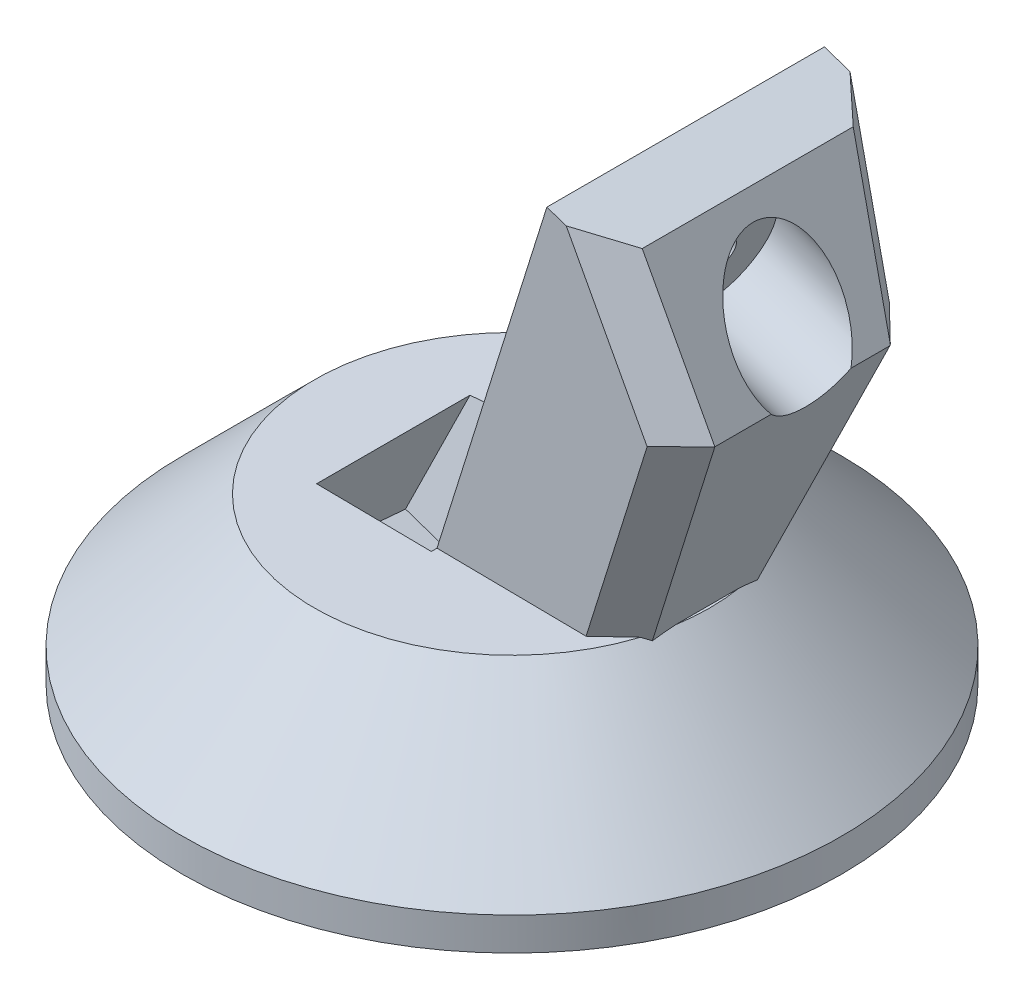
ISO-10303-21;
HEADER;
FILE_DESCRIPTION(('STEP AP214'),'2;1');
FILE_NAME('part.step','',(''),(''),'','','');
FILE_SCHEMA(('AUTOMOTIVE_DESIGN { 1 0 10303 214 1 1 1 1 }'));
ENDSEC;
DATA;
#1=APPLICATION_CONTEXT('core data for automotive mechanical design processes');
#2=APPLICATION_PROTOCOL_DEFINITION('international standard','automotive_design',2000,#1);
#3=PRODUCT_CONTEXT('',#1,'mechanical');
#4=PRODUCT('Part','Part','',(#3));
#5=PRODUCT_RELATED_PRODUCT_CATEGORY('part','',(#4));
#6=PRODUCT_DEFINITION_FORMATION('','',#4);
#7=PRODUCT_DEFINITION_CONTEXT('part definition',#1,'design');
#8=PRODUCT_DEFINITION('design','',#6,#7);
#9=PRODUCT_DEFINITION_SHAPE('','',#8);
#10=(LENGTH_UNIT() NAMED_UNIT(*) SI_UNIT(.MILLI.,.METRE.));
#11=(NAMED_UNIT(*) PLANE_ANGLE_UNIT() SI_UNIT($,.RADIAN.));
#12=(NAMED_UNIT(*) SI_UNIT($,.STERADIAN.) SOLID_ANGLE_UNIT());
#13=UNCERTAINTY_MEASURE_WITH_UNIT(LENGTH_MEASURE(1.E-05),#10,'distance_accuracy_value','');
#14=(GEOMETRIC_REPRESENTATION_CONTEXT(3) GLOBAL_UNCERTAINTY_ASSIGNED_CONTEXT((#13)) GLOBAL_UNIT_ASSIGNED_CONTEXT((#10,
#11,#12)) REPRESENTATION_CONTEXT('',''));
#15=CARTESIAN_POINT('',(0.,0.,0.));
#16=DIRECTION('',(0.,0.,1.));
#17=DIRECTION('',(1.,0.,0.));
#18=AXIS2_PLACEMENT_3D('',#15,#16,#17);
#19=CARTESIAN_POINT('',(-27.7596757204934,54.7423370391326,-3.17601245662759));
#20=DIRECTION('',(0.946930129495105,-0.321439465303162,0.));
#21=DIRECTION('',(0.321439465303162,0.946930129495106,0.));
#22=AXIS2_PLACEMENT_3D('',#19,#20,#21);
#23=CYLINDRICAL_SURFACE('',#22,1.5);
#24=CARTESIAN_POINT('',(10.0065690125101,41.922424423238,-3.17601245662759));
#25=DIRECTION('',(0.946930129495105,-0.321439465303162,0.));
#26=DIRECTION('',(-0.321439465303162,-0.946930129495106,0.));
#27=AXIS2_PLACEMENT_3D('',#24,#25,#26);
#28=CIRCLE('',#27,1.5);
#29=CARTESIAN_POINT('',(9.52440981455531,40.5020292289954,-3.17601245662759));
#30=VERTEX_POINT('',#29);
#31=EDGE_CURVE('E172',#30,#30,#28,.T.);
#32=ORIENTED_EDGE('',*,*,#31,.F.);
#33=EDGE_LOOP('',(#32));
#34=FACE_BOUND('',#33,.T.);
#35=CARTESIAN_POINT('',(15.6881497894807,39.993787631419,-3.17601245662759));
#36=DIRECTION('',(-0.946930129495106,0.321439465303162,0.));
#37=DIRECTION('',(0.321439465303162,0.946930129495105,0.));
#38=AXIS2_PLACEMENT_3D('',#35,#36,#37);
#39=CIRCLE('',#38,1.5);
#40=CARTESIAN_POINT('',(16.1703089874354,41.4141828256617,-3.17601245662759));
#41=VERTEX_POINT('',#40);
#42=EDGE_CURVE('E169',#41,#41,#39,.F.);
#43=ORIENTED_EDGE('',*,*,#42,.T.);
#44=EDGE_LOOP('',(#43));
#45=FACE_BOUND('',#44,.T.);
#46=ADVANCED_FACE('F37',(#34,#45),#23,.F.);
#47=CARTESIAN_POINT('',(-18.,15.,0.));
#48=DIRECTION('',(0.,1.,0.));
#49=DIRECTION('',(0.,0.,-1.));
#50=AXIS2_PLACEMENT_3D('',#47,#48,#49);
#51=PLANE('',#50);
#52=DIRECTION('',(-0.999934455038665,0.,-0.0114492631434682));
#53=VECTOR('',#52,1.);
#54=CARTESIAN_POINT('',(-18.0856382371058,15.,7.47931311193634));
#55=LINE('',#54,#53);
#56=CARTESIAN_POINT('',(14.5962110075819,15.,7.85352073137787));
#57=VERTEX_POINT('',#56);
#58=CARTESIAN_POINT('',(0.867637383114527,15.,7.69632837620003));
#59=VERTEX_POINT('',#58);
#60=EDGE_CURVE('E326',#57,#59,#55,.T.);
#61=ORIENTED_EDGE('',*,*,#60,.T.);
#62=DIRECTION('',(0.,0.,-1.));
#63=VECTOR('',#62,1.);
#64=CARTESIAN_POINT('',(0.867637383114527,15.,0.));
#65=LINE('',#64,#63);
#66=CARTESIAN_POINT('',(0.867637383114527,15.,8.2163739237018));
#67=VERTEX_POINT('',#66);
#68=EDGE_CURVE('E304',#67,#59,#65,.T.);
#69=ORIENTED_EDGE('',*,*,#68,.F.);
#70=DIRECTION('',(-0.999934455038665,0.,-0.0114492631434682));
#71=VECTOR('',#70,1.);
#72=CARTESIAN_POINT('',(-18.091591985162,15.,7.99929048894169));
#73=LINE('',#72,#71);
#74=CARTESIAN_POINT('',(-9.69280386647578,15.,8.09545672741115));
#75=VERTEX_POINT('',#74);
#76=EDGE_CURVE('E315',#67,#75,#73,.T.);
#77=ORIENTED_EDGE('',*,*,#76,.T.);
#78=DIRECTION('',(0.,0.,-1.));
#79=VECTOR('',#78,1.);
#80=CARTESIAN_POINT('',(-9.69280386647578,15.,0.));
#81=LINE('',#80,#79);
#82=CARTESIAN_POINT('',(-9.69280386647578,15.,-5.86679490536974));
#83=VERTEX_POINT('',#82);
#84=EDGE_CURVE('E318',#75,#83,#81,.T.);
#85=ORIENTED_EDGE('',*,*,#84,.T.);
#86=DIRECTION('',(0.99580121253747,0.,-0.0915420401176663));
#87=VECTOR('',#86,1.);
#88=CARTESIAN_POINT('',(-18.4651895330117,15.,-5.06036680455694));
#89=LINE('',#88,#87);
#90=CARTESIAN_POINT('',(0.867637383114526,15.,-6.83759542695866));
#91=VERTEX_POINT('',#90);
#92=EDGE_CURVE('E312',#83,#91,#89,.T.);
#93=ORIENTED_EDGE('',*,*,#92,.T.);
#94=CARTESIAN_POINT('',(0.867637383114528,15.,-6.31754987945689));
#95=VERTEX_POINT('',#94);
#96=EDGE_CURVE('E300',#95,#91,#65,.T.);
#97=ORIENTED_EDGE('',*,*,#96,.F.);
#98=DIRECTION('',(0.99580121253747,0.,-0.0915420401176663));
#99=VECTOR('',#98,1.);
#100=CARTESIAN_POINT('',(-18.4177833902428,15.,-4.54467921019736));
#101=LINE('',#100,#99);
#102=CARTESIAN_POINT('',(14.5962110075819,15.,-7.57959055752248));
#103=VERTEX_POINT('',#102);
#104=EDGE_CURVE('E323',#95,#103,#101,.T.);
#105=ORIENTED_EDGE('',*,*,#104,.T.);
#106=DIRECTION('',(0.745897481200364,0.,0.666060768653246));
#107=VECTOR('',#106,1.);
#108=CARTESIAN_POINT('',(15.7204142178493,15.,-6.57571579828868));
#109=LINE('',#108,#107);
#110=CARTESIAN_POINT('',(17.2219620185472,15.,-5.2348853121835));
#111=VERTEX_POINT('',#110);
#112=EDGE_CURVE('E46',#111,#103,#109,.F.);
#113=ORIENTED_EDGE('',*,*,#112,.F.);
#114=CARTESIAN_POINT('',(0.,15.,0.));
#115=DIRECTION('',(0.,-1.,0.));
#116=DIRECTION('',(0.,0.,-1.));
#117=AXIS2_PLACEMENT_3D('',#114,#115,#116);
#118=CIRCLE('',#117,18.);
#119=CARTESIAN_POINT('',(17.1513905962115,15.,5.46166646877923));
#120=VERTEX_POINT('',#119);
#121=EDGE_CURVE('E364',#120,#111,#118,.T.);
#122=ORIENTED_EDGE('',*,*,#121,.F.);
#123=DIRECTION('',(-0.730054006471106,0.,0.68338945531482));
#124=VECTOR('',#123,1.);
#125=CARTESIAN_POINT('',(13.9186151586497,15.,8.4878051185888));
#126=LINE('',#125,#124);
#127=EDGE_CURVE('E239',#57,#120,#126,.F.);
#128=ORIENTED_EDGE('',*,*,#127,.F.);
#129=EDGE_LOOP('',(#61,#69,#77,#85,#93,#97,#105,#113,#122,#128));
#130=FACE_BOUND('',#129,.T.);
#131=ADVANCED_FACE('F263',(#130),#51,.T.);
#132=CARTESIAN_POINT('',(0.,0.,0.));
#133=DIRECTION('',(0.,-1.,0.));
#134=DIRECTION('',(0.,0.,1.));
#135=AXIS2_PLACEMENT_3D('',#132,#133,#134);
#136=PLANE('',#135);
#137=CARTESIAN_POINT('',(16.,0.,0.));
#138=DIRECTION('',(0.,1.,0.));
#139=DIRECTION('',(0.,0.,1.));
#140=AXIS2_PLACEMENT_3D('',#137,#138,#139);
#141=CIRCLE('',#140,1.75);
#142=CARTESIAN_POINT('',(16.,0.,1.75));
#143=VERTEX_POINT('',#142);
#144=EDGE_CURVE('E175',#143,#143,#141,.T.);
#145=ORIENTED_EDGE('',*,*,#144,.T.);
#146=EDGE_LOOP('',(#145));
#147=FACE_BOUND('',#146,.T.);
#148=CARTESIAN_POINT('',(-16.,0.,0.));
#149=DIRECTION('',(0.,1.,0.));
#150=DIRECTION('',(0.,0.,1.));
#151=AXIS2_PLACEMENT_3D('',#148,#149,#150);
#152=CIRCLE('',#151,1.75);
#153=CARTESIAN_POINT('',(-16.,0.,1.75));
#154=VERTEX_POINT('',#153);
#155=EDGE_CURVE('E179',#154,#154,#152,.T.);
#156=ORIENTED_EDGE('',*,*,#155,.T.);
#157=EDGE_LOOP('',(#156));
#158=FACE_BOUND('',#157,.T.);
#159=CARTESIAN_POINT('',(0.,0.,0.));
#160=DIRECTION('',(0.,-1.,0.));
#161=DIRECTION('',(0.,0.,-1.));
#162=AXIS2_PLACEMENT_3D('',#159,#160,#161);
#163=CIRCLE('',#162,30.);
#164=CARTESIAN_POINT('',(0.,0.,-30.));
#165=VERTEX_POINT('',#164);
#166=EDGE_CURVE('E298',#165,#165,#163,.T.);
#167=ORIENTED_EDGE('',*,*,#166,.T.);
#168=EDGE_LOOP('',(#167));
#169=FACE_BOUND('',#168,.T.);
#170=ADVANCED_FACE('F269',(#147,#158,#169),#136,.T.);
#171=CARTESIAN_POINT('',(0.,15.,0.));
#172=DIRECTION('',(0.,1.,0.));
#173=DIRECTION('',(0.,0.,-1.));
#174=AXIS2_PLACEMENT_3D('',#171,#172,#173);
#175=CYLINDRICAL_SURFACE('',#174,30.);
#176=ORIENTED_EDGE('',*,*,#166,.F.);
#177=EDGE_LOOP('',(#176));
#178=FACE_BOUND('',#177,.T.);
#179=CARTESIAN_POINT('',(0.,3.,0.));
#180=DIRECTION('',(0.,-1.,0.));
#181=DIRECTION('',(0.,0.,-1.));
#182=AXIS2_PLACEMENT_3D('',#179,#180,#181);
#183=CIRCLE('',#182,30.);
#184=CARTESIAN_POINT('',(0.,3.,-30.));
#185=VERTEX_POINT('',#184);
#186=EDGE_CURVE('E301',#185,#185,#183,.T.);
#187=ORIENTED_EDGE('',*,*,#186,.T.);
#188=EDGE_LOOP('',(#187));
#189=FACE_BOUND('',#188,.T.);
#190=ADVANCED_FACE('F223',(#178,#189),#175,.T.);
#191=CARTESIAN_POINT('',(0.,15.,0.));
#192=DIRECTION('',(0.,-1.,0.));
#193=DIRECTION('',(0.,0.,1.));
#194=AXIS2_PLACEMENT_3D('',#191,#192,#193);
#195=CONICAL_SURFACE('',#194,18.,0.78539816339745);
#196=CARTESIAN_POINT('',(16.0925530766064,10.0750645714377,-16.3273512818325));
#197=CARTESIAN_POINT('',(16.1743657123231,10.3160768244306,-15.9082564784611));
#198=CARTESIAN_POINT('',(16.2545727723403,10.5523592039352,-15.4860846850062));
#199=CARTESIAN_POINT('',(16.4113090044216,11.0140892544172,-14.6350154059007));
#200=CARTESIAN_POINT('',(16.4878370085888,11.2395334848812,-14.206115841115));
#201=CARTESIAN_POINT('',(16.6370372036006,11.6790630860456,-13.3393017745053));
#202=CARTESIAN_POINT('',(16.7096901204921,11.8930916775111,-12.9013549709433));
#203=CARTESIAN_POINT('',(16.8501524625984,12.3068803940724,-12.0181012953445));
#204=CARTESIAN_POINT('',(16.9179623373143,12.5066418433554,-11.5727951110959));
#205=CARTESIAN_POINT('',(17.1103636528263,13.0734378416036,-10.244580786781));
#206=CARTESIAN_POINT('',(17.2272362457449,13.4177333979765,-9.35046633830621));
#207=CARTESIAN_POINT('',(17.3823847378484,13.874786117312,-7.9882170158982));
#208=CARTESIAN_POINT('',(17.430707703959,14.0171409850118,-7.5310257865221));
#209=CARTESIAN_POINT('',(17.5199280865168,14.2799757564962,-6.60971195449791));
#210=CARTESIAN_POINT('',(17.5608268478918,14.4004596223107,-6.14559062378861));
#211=CARTESIAN_POINT('',(17.6335962847623,14.6148314705653,-5.22196807931709));
#212=CARTESIAN_POINT('',(17.6656553463128,14.7092744204281,-4.76261174589229));
#213=CARTESIAN_POINT('',(17.7074909244413,14.8325180594047,-4.06873116180376));
#214=CARTESIAN_POINT('',(17.7204193852108,14.8706040766868,-3.83601762160133));
#215=CARTESIAN_POINT('',(17.7440794689754,14.9403044358569,-3.36951245668766));
#216=CARTESIAN_POINT('',(17.754811086229,14.9719187608312,-3.13572082916043));
#217=CARTESIAN_POINT('',(17.7644112733108,15.0002,-2.90146379482268));
#218=B_SPLINE_CURVE_WITH_KNOTS('',3,(#196,#197,#198,#199,#200,#201,#202,#203,#204,#205,#206,
#207,#208,#209,#210,#211,#212,#213,#214,#215,#216,#217),.UNSPECIFIED.,.F.,.F.,(4,2,2,2,2,2,2,2,
2,2,4),(0.,1.47099772397933,2.94245936605079,4.42066322346395,5.8987297044391,8.79039829750672,
10.2337361395808,11.6768122530344,13.086217032091,13.7946183234912,14.5030214662946),.UNSPECIFIED.);
#219=CARTESIAN_POINT('',(17.6705046552463,14.7235600238837,-4.66706796923942));
#220=VERTEX_POINT('',#219);
#221=CARTESIAN_POINT('',(17.764343382459,15.,-2.90311973402459));
#222=VERTEX_POINT('',#221);
#223=EDGE_CURVE('E209',#220,#222,#218,.T.);
#224=ORIENTED_EDGE('',*,*,#223,.T.);
#225=CARTESIAN_POINT('',(17.764343382459,15.,2.90311973402459));
#226=VERTEX_POINT('',#225);
#227=EDGE_CURVE('E307',#222,#226,#118,.T.);
#228=ORIENTED_EDGE('',*,*,#227,.T.);
#229=CARTESIAN_POINT('',(17.7644112733108,15.0002,2.90146379482269));
#230=CARTESIAN_POINT('',(17.7538094403526,14.9689680072311,3.16017374443213));
#231=CARTESIAN_POINT('',(17.7418271390909,14.9336692859782,3.41831185686817));
#232=CARTESIAN_POINT('',(17.7151929502917,14.8552074959027,3.93323023362946));
#233=CARTESIAN_POINT('',(17.700541292865,14.8120451049644,4.19001061303562));
#234=CARTESIAN_POINT('',(17.6528249628675,14.6714773296264,4.9563136798201));
#235=CARTESIAN_POINT('',(17.615925301368,14.5627744321489,5.46356611740808));
#236=CARTESIAN_POINT('',(17.5327830992425,14.3178454028183,6.47027993328461));
#237=CARTESIAN_POINT('',(17.4865442950401,14.1816302781143,6.96974434161032));
#238=CARTESIAN_POINT('',(17.3855015906053,13.8839680694469,7.96207567437167));
#239=CARTESIAN_POINT('',(17.3306696295711,13.7224383210275,8.45491502843382));
#240=CARTESIAN_POINT('',(17.2720935842753,13.5498788560439,8.94326538410898));
#241=B_SPLINE_CURVE_WITH_KNOTS('',3,(#229,#230,#231,#232,#233,#234,#235,#236,#237,#238,#239,
#240),.UNSPECIFIED.,.F.,.F.,(4,2,2,2,2,4),(0.,0.782332225327559,1.56459704192477,
3.1237886397926,4.68235766432573,6.24612649572785),.UNSPECIFIED.);
#242=CARTESIAN_POINT('',(17.6565775683773,14.6825321489776,4.87595088624926));
#243=VERTEX_POINT('',#242);
#244=EDGE_CURVE('E200',#226,#243,#241,.T.);
#245=ORIENTED_EDGE('',*,*,#244,.T.);
#246=CARTESIAN_POINT('',(17.1513905962115,15.,5.46166646877924));
#247=CARTESIAN_POINT('',(17.2363760239892,14.9486671559689,5.36387089394197));
#248=CARTESIAN_POINT('',(17.3209676669789,14.8965450700632,5.26616345740996));
#249=CARTESIAN_POINT('',(17.4893633238102,14.7907224519389,5.07092493002468));
#250=CARTESIAN_POINT('',(17.5731673382091,14.7370219208371,4.9733938390467));
#251=CARTESIAN_POINT('',(17.6565775683773,14.6825321489776,4.87595088624926));
#252=B_SPLINE_CURVE_WITH_KNOTS('',3,(#246,#247,#248,#249,#250,#251),.UNSPECIFIED.,.F.,.F.,(4,2,
4),(0.,0.418058380502809,0.836116465218344),.UNSPECIFIED.);
#253=EDGE_CURVE('E232',#120,#243,#252,.T.);
#254=ORIENTED_EDGE('',*,*,#253,.F.);
#255=ORIENTED_EDGE('',*,*,#121,.T.);
#256=CARTESIAN_POINT('',(17.6705046552467,14.7235600238852,-4.66706796923994));
#257=CARTESIAN_POINT('',(17.5965648819781,14.7708929410682,-4.76173656687664));
#258=CARTESIAN_POINT('',(17.5222164520292,14.8175960585582,-4.85638896540984));
#259=CARTESIAN_POINT('',(17.3727022402175,14.9097427179127,-5.0456614130744));
#260=CARTESIAN_POINT('',(17.2975364579333,14.9551862591277,-5.14028146218906));
#261=CARTESIAN_POINT('',(17.2219620185473,15.,-5.23488531218351));
#262=B_SPLINE_CURVE_WITH_KNOTS('',3,(#256,#257,#258,#259,#260,#261),.UNSPECIFIED.,.F.,.F.,(4,2,
4),(0.,0.387313207759773,0.774626615262219),.UNSPECIFIED.);
#263=EDGE_CURVE('E58',#220,#111,#262,.T.);
#264=ORIENTED_EDGE('',*,*,#263,.F.);
#265=EDGE_LOOP('',(#224,#228,#245,#254,#255,#264));
#266=FACE_BOUND('',#265,.T.);
#267=ORIENTED_EDGE('',*,*,#186,.F.);
#268=EDGE_LOOP('',(#267));
#269=FACE_BOUND('',#268,.T.);
#270=ADVANCED_FACE('F217',(#266,#269),#195,.T.);
#271=DIRECTION('',(0.,0.,1.));
#272=VECTOR('',#271,1.);
#273=CARTESIAN_POINT('',(17.764343382459,15.,0.));
#274=LINE('',#273,#272);
#275=EDGE_CURVE('E321',#222,#226,#274,.T.);
#276=ORIENTED_EDGE('',*,*,#275,.T.);
#277=ORIENTED_EDGE('',*,*,#227,.F.);
#278=EDGE_LOOP('',(#276,#277));
#279=FACE_BOUND('',#278,.T.);
#280=ADVANCED_FACE('F222',(#279),#51,.T.);
#281=CARTESIAN_POINT('',(-12.3371427862094,7.21002874264162,7.80241819751683));
#282=DIRECTION('',(-0.0114427563092417,-0.033709273077193,0.999366173250153));
#283=DIRECTION('',(0.,0.999431606516327,0.0337114801839541));
#284=AXIS2_PLACEMENT_3D('',#281,#282,#283);
#285=PLANE('',#284);
#286=ORIENTED_EDGE('',*,*,#76,.F.);
#287=DIRECTION('',(0.321235728371597,0.946329939848795,0.0355984797898093));
#288=VECTOR('',#287,1.);
#289=CARTESIAN_POINT('',(-2.86784149125832,3.99563408961,7.80241819751683));
#290=LINE('',#289,#288);
#291=CARTESIAN_POINT('',(-2.86784149125832,3.99563408961,7.80241819751683));
#292=VERTEX_POINT('',#291);
#293=EDGE_CURVE('E374',#292,#67,#290,.T.);
#294=ORIENTED_EDGE('',*,*,#293,.F.);
#295=DIRECTION('',(0.946930129495105,-0.321439465303162,0.));
#296=VECTOR('',#295,1.);
#297=CARTESIAN_POINT('',(-12.3371427862094,7.21002874264162,7.80241819751683));
#298=LINE('',#297,#296);
#299=CARTESIAN_POINT('',(-12.3371427862094,7.21002874264162,7.80241819751683));
#300=VERTEX_POINT('',#299);
#301=EDGE_CURVE('E365',#300,#292,#298,.T.);
#302=ORIENTED_EDGE('',*,*,#301,.F.);
#303=DIRECTION('',(0.321235728371597,0.946329939848795,0.0355984797898093));
#304=VECTOR('',#303,1.);
#305=CARTESIAN_POINT('',(-12.3371427862094,7.21002874264162,7.80241819751683));
#306=LINE('',#305,#304);
#307=EDGE_CURVE('E372',#300,#75,#306,.T.);
#308=ORIENTED_EDGE('',*,*,#307,.T.);
#309=EDGE_LOOP('',(#286,#294,#302,#308));
#310=FACE_BOUND('',#309,.T.);
#311=ADVANCED_FACE('F405',(#310),#285,.F.);
#312=CARTESIAN_POINT('',(-12.7986617499973,5.85043771752586,-3.10347527759508));
#313=DIRECTION('',(-0.318689506117566,-0.93882901096796,0.130526192220049));
#314=DIRECTION('',(0.946930129495106,-0.321439465303162,0.));
#315=AXIS2_PLACEMENT_3D('',#312,#313,#314);
#316=PLANE('',#315);
#317=DIRECTION('',(0.0419562694352702,0.123599184101434,0.991444861373811));
#318=VECTOR('',#317,1.);
#319=CARTESIAN_POINT('',(-3.32936045504629,2.63604306449423,-3.10347527759508));
#320=LINE('',#319,#318);
#321=CARTESIAN_POINT('',(-3.32936045504629,2.63604306449423,-3.10347527759508));
#322=VERTEX_POINT('',#321);
#323=EDGE_CURVE('E377',#322,#292,#320,.T.);
#324=ORIENTED_EDGE('',*,*,#323,.F.);
#325=DIRECTION('',(0.946930129495105,-0.321439465303162,0.));
#326=VECTOR('',#325,1.);
#327=CARTESIAN_POINT('',(-12.7986617499973,5.85043771752586,-3.10347527759508));
#328=LINE('',#327,#326);
#329=CARTESIAN_POINT('',(-12.7986617499973,5.85043771752586,-3.10347527759508));
#330=VERTEX_POINT('',#329);
#331=EDGE_CURVE('E368',#330,#322,#328,.T.);
#332=ORIENTED_EDGE('',*,*,#331,.F.);
#333=DIRECTION('',(0.0419562694352702,0.123599184101434,0.991444861373811));
#334=VECTOR('',#333,1.);
#335=CARTESIAN_POINT('',(-12.7986617499973,5.85043771752586,-3.10347527759508));
#336=LINE('',#335,#334);
#337=EDGE_CURVE('E382',#330,#300,#336,.T.);
#338=ORIENTED_EDGE('',*,*,#337,.T.);
#339=ORIENTED_EDGE('',*,*,#301,.T.);
#340=EDGE_LOOP('',(#324,#332,#338,#339));
#341=FACE_BOUND('',#340,.T.);
#342=ADVANCED_FACE('F395',(#341),#316,.F.);
#343=CARTESIAN_POINT('',(-6.83149115798718,23.429155427507,-8.41253970925067));
#344=DIRECTION('',(-0.0883845913149542,-0.260372609879457,-0.961454246463475));
#345=DIRECTION('',(0.,-0.965231754320216,0.2613956014395));
#346=AXIS2_PLACEMENT_3D('',#343,#344,#345);
#347=PLANE('',#346);
#348=ORIENTED_EDGE('',*,*,#92,.F.);
#349=DIRECTION('',(-0.309049338896674,-0.910429994107277,0.27496496496345));
#350=VECTOR('',#349,1.);
#351=CARTESIAN_POINT('',(-6.83149115798718,23.429155427507,-8.41253970925067));
#352=LINE('',#351,#350);
#353=EDGE_CURVE('E376',#83,#330,#352,.T.);
#354=ORIENTED_EDGE('',*,*,#353,.T.);
#355=ORIENTED_EDGE('',*,*,#331,.T.);
#356=DIRECTION('',(-0.309049338896674,-0.910429994107277,0.27496496496345));
#357=VECTOR('',#356,1.);
#358=CARTESIAN_POINT('',(2.63781013696388,20.2147607744754,-8.41253970925067));
#359=LINE('',#358,#357);
#360=EDGE_CURVE('E379',#91,#322,#359,.T.);
#361=ORIENTED_EDGE('',*,*,#360,.F.);
#362=EDGE_LOOP('',(#348,#354,#355,#361));
#363=FACE_BOUND('',#362,.T.);
#364=ADVANCED_FACE('F386',(#363),#347,.F.);
#365=CARTESIAN_POINT('',(-13.2570218129315,4.50015251424427,0.));
#366=DIRECTION('',(-0.946930129495105,0.321439465303162,0.));
#367=DIRECTION('',(-0.321439465303162,-0.946930129495106,0.));
#368=AXIS2_PLACEMENT_3D('',#365,#366,#367);
#369=PLANE('',#368);
#370=ORIENTED_EDGE('',*,*,#84,.F.);
#371=ORIENTED_EDGE('',*,*,#307,.F.);
#372=ORIENTED_EDGE('',*,*,#337,.F.);
#373=ORIENTED_EDGE('',*,*,#353,.F.);
#374=EDGE_LOOP('',(#370,#371,#372,#373));
#375=FACE_BOUND('',#374,.T.);
#376=ADVANCED_FACE('F392',(#375),#369,.F.);
#377=CARTESIAN_POINT('',(-3.78772051798042,1.28575786121265,0.));
#378=DIRECTION('',(-0.946930129495105,0.321439465303162,0.));
#379=DIRECTION('',(-0.321439465303162,-0.946930129495106,0.));
#380=AXIS2_PLACEMENT_3D('',#377,#378,#379);
#381=PLANE('',#380);
#382=ORIENTED_EDGE('',*,*,#31,.T.);
#383=EDGE_LOOP('',(#382));
#384=FACE_BOUND('',#383,.T.);
#385=ORIENTED_EDGE('',*,*,#293,.T.);
#386=ORIENTED_EDGE('',*,*,#68,.T.);
#387=DIRECTION('',(-0.321235728371597,-0.946329939848795,-0.0355984797898091));
#388=VECTOR('',#387,1.);
#389=CARTESIAN_POINT('',(0.867637383114528,15.,7.69632837620003));
#390=LINE('',#389,#388);
#391=CARTESIAN_POINT('',(12.1180186687252,48.1425545323287,8.94306538410898));
#392=VERTEX_POINT('',#391);
#393=EDGE_CURVE('E195',#392,#59,#390,.T.);
#394=ORIENTED_EDGE('',*,*,#393,.F.);
#395=DIRECTION('',(0.,0.,1.));
#396=VECTOR('',#395,1.);
#397=CARTESIAN_POINT('',(12.1180186687252,48.1425545323287,8.94306538410898));
#398=LINE('',#397,#396);
#399=CARTESIAN_POINT('',(12.1180186687252,48.1425545323287,-16.3271512818325));
#400=VERTEX_POINT('',#399);
#401=EDGE_CURVE('E191',#400,#392,#398,.T.);
#402=ORIENTED_EDGE('',*,*,#401,.F.);
#403=DIRECTION('',(0.309049338896674,0.910429994107277,-0.27496496496345));
#404=VECTOR('',#403,1.);
#405=CARTESIAN_POINT('',(12.1180186687252,48.1425545323287,-16.3271512818325));
#406=LINE('',#405,#404);
#407=EDGE_CURVE('E188',#95,#400,#406,.T.);
#408=ORIENTED_EDGE('',*,*,#407,.F.);
#409=ORIENTED_EDGE('',*,*,#96,.T.);
#410=ORIENTED_EDGE('',*,*,#360,.T.);
#411=ORIENTED_EDGE('',*,*,#323,.T.);
#412=EDGE_LOOP('',(#385,#386,#394,#402,#408,#409,#410,#411));
#413=FACE_BOUND('',#412,.T.);
#414=ADVANCED_FACE('F398',(#384,#413),#381,.T.);
#415=CARTESIAN_POINT('',(16.0185194550362,9.8569685551494,7.69632837620003));
#416=DIRECTION('',(-0.0114427563092417,-0.0337092730771928,0.999366173250153));
#417=DIRECTION('',(0.,0.999431606516327,0.0337114801839539));
#418=AXIS2_PLACEMENT_3D('',#415,#416,#417);
#419=PLANE('',#418);
#420=DIRECTION('',(-0.946930129495105,0.321439465303162,0.));
#421=VECTOR('',#420,1.);
#422=CARTESIAN_POINT('',(27.2689007406469,42.9995230874781,8.94306538410898));
#423=LINE('',#422,#421);
#424=CARTESIAN_POINT('',(13.8807903903369,47.5441741640237,8.94306538410898));
#425=VERTEX_POINT('',#424);
#426=EDGE_CURVE('E198',#425,#392,#423,.T.);
#427=ORIENTED_EDGE('',*,*,#426,.T.);
#428=ORIENTED_EDGE('',*,*,#393,.T.);
#429=ORIENTED_EDGE('',*,*,#60,.F.);
#430=DIRECTION('',(-0.321235728371597,-0.946329939848795,-0.0355984797898091));
#431=VECTOR('',#430,1.);
#432=CARTESIAN_POINT('',(13.1777290665509,10.8212869510589,7.69632837620003));
#433=LINE('',#432,#431);
#434=CARTESIAN_POINT('',(20.8477776715255,33.4165215215628,8.5463025420101));
#435=VERTEX_POINT('',#434);
#436=EDGE_CURVE('E331',#435,#57,#433,.T.);
#437=ORIENTED_EDGE('',*,*,#436,.F.);
#438=DIRECTION('',(0.44214845636508,-0.896588375407576,-0.0251799050431326));
#439=VECTOR('',#438,1.);
#440=CARTESIAN_POINT('',(29.252743273097,16.3729373009558,8.0676482966052));
#441=LINE('',#440,#439);
#442=EDGE_CURVE('E333',#425,#435,#441,.T.);
#443=ORIENTED_EDGE('',*,*,#442,.F.);
#444=EDGE_LOOP('',(#427,#428,#429,#437,#443));
#445=FACE_BOUND('',#444,.T.);
#446=ADVANCED_FACE('F423',(#445),#419,.T.);
#447=CARTESIAN_POINT('',(27.2689007406469,42.9995230874781,8.94306538410898));
#448=DIRECTION('',(0.321439465303162,0.946930129495105,0.));
#449=DIRECTION('',(-0.946930129495106,0.321439465303162,0.));
#450=AXIS2_PLACEMENT_3D('',#447,#448,#449);
#451=PLANE('',#450);
#452=DIRECTION('',(0.,0.,1.));
#453=VECTOR('',#452,1.);
#454=CARTESIAN_POINT('',(17.7995994456959,46.2139177405097,8.94306538410898));
#455=LINE('',#454,#453);
#456=CARTESIAN_POINT('',(17.7995994456959,46.2139177405097,-13.2664238051408));
#457=VERTEX_POINT('',#456);
#458=CARTESIAN_POINT('',(17.7995994456959,46.2139177405097,5.94211389020302));
#459=VERTEX_POINT('',#458);
#460=EDGE_CURVE('E162',#457,#459,#455,.T.);
#461=ORIENTED_EDGE('',*,*,#460,.F.);
#462=DIRECTION('',(0.716382617046374,-0.243179130332083,0.653957075475692));
#463=VECTOR('',#462,1.);
#464=CARTESIAN_POINT('',(33.6240395173622,40.8422441640543,1.17907543515884));
#465=LINE('',#464,#463);
#466=CARTESIAN_POINT('',(14.4467005444596,47.3520735520727,-16.3271512818325));
#467=VERTEX_POINT('',#466);
#468=EDGE_CURVE('E346',#467,#457,#465,.T.);
#469=ORIENTED_EDGE('',*,*,#468,.F.);
#470=DIRECTION('',(-0.946930129495105,0.321439465303162,0.));
#471=VECTOR('',#470,1.);
#472=CARTESIAN_POINT('',(27.2689007406469,42.9995230874781,-16.3271512818325));
#473=LINE('',#472,#471);
#474=EDGE_CURVE('E197',#467,#400,#473,.T.);
#475=ORIENTED_EDGE('',*,*,#474,.T.);
#476=ORIENTED_EDGE('',*,*,#401,.T.);
#477=ORIENTED_EDGE('',*,*,#426,.F.);
#478=DIRECTION('',(-0.766592941916583,0.260223238948189,0.587042696330507));
#479=VECTOR('',#478,1.);
#480=CARTESIAN_POINT('',(22.6551018353263,44.5656967754284,2.22385996560843));
#481=LINE('',#480,#479);
#482=EDGE_CURVE('E349',#459,#425,#481,.T.);
#483=ORIENTED_EDGE('',*,*,#482,.F.);
#484=EDGE_LOOP('',(#461,#469,#475,#476,#477,#483));
#485=FACE_BOUND('',#484,.T.);
#486=ADVANCED_FACE('F429',(#485),#451,.T.);
#487=CARTESIAN_POINT('',(27.2689007406469,42.9995230874781,-16.3271512818325));
#488=DIRECTION('',(-0.0883845913149541,-0.260372609879457,-0.961454246463475));
#489=DIRECTION('',(0.,-0.965231754320216,0.2613956014395));
#490=AXIS2_PLACEMENT_3D('',#487,#488,#489);
#491=PLANE('',#490);
#492=DIRECTION('',(0.309049338896674,0.910429994107278,-0.27496496496345));
#493=VECTOR('',#492,1.);
#494=CARTESIAN_POINT('',(24.4281103521616,43.9638414833876,-16.3271512818325));
#495=LINE('',#494,#493);
#496=CARTESIAN_POINT('',(21.0398782834764,33.9824316756855,-13.3125998986129));
#497=VERTEX_POINT('',#496);
#498=EDGE_CURVE('E351',#103,#497,#495,.T.);
#499=ORIENTED_EDGE('',*,*,#498,.F.);
#500=ORIENTED_EDGE('',*,*,#104,.F.);
#501=ORIENTED_EDGE('',*,*,#407,.T.);
#502=ORIENTED_EDGE('',*,*,#474,.F.);
#503=DIRECTION('',(-0.433513300599761,0.879078011710579,-0.198212178056941));
#504=VECTOR('',#503,1.);
#505=CARTESIAN_POINT('',(18.5151473249504,39.1020796035683,-14.4669645319584));
#506=LINE('',#505,#504);
#507=EDGE_CURVE('E354',#497,#467,#506,.T.);
#508=ORIENTED_EDGE('',*,*,#507,.F.);
#509=EDGE_LOOP('',(#499,#500,#501,#502,#508));
#510=FACE_BOUND('',#509,.T.);
#511=ADVANCED_FACE('F426',(#510),#491,.T.);
#512=CARTESIAN_POINT('',(11.3631615539413,-3.85727358363795,0.));
#513=DIRECTION('',(0.946930129495105,-0.321439465303162,0.));
#514=DIRECTION('',(0.321439465303162,0.946930129495106,0.));
#515=AXIS2_PLACEMENT_3D('',#512,#513,#514);
#516=PLANE('',#515);
#517=CARTESIAN_POINT('',(25.1574510844318,36.7793929783874,-3.17601245662759));
#518=DIRECTION('',(-0.946930129495106,0.321439465303162,0.));
#519=DIRECTION('',(0.321439465303162,0.946930129495105,0.));
#520=AXIS2_PLACEMENT_3D('',#517,#518,#519);
#521=CIRCLE('',#520,5.);
#522=CARTESIAN_POINT('',(24.0545060876153,33.530221792527,-6.81282410132022));
#523=VERTEX_POINT('',#522);
#524=CARTESIAN_POINT('',(24.0545060876153,33.530221792527,0.460799188065035));
#525=VERTEX_POINT('',#524);
#526=EDGE_CURVE('E159',#523,#525,#521,.T.);
#527=ORIENTED_EDGE('',*,*,#526,.T.);
#528=DIRECTION('',(0.,0.,-1.));
#529=VECTOR('',#528,1.);
#530=CARTESIAN_POINT('',(24.0545060876153,33.530221792527,0.));
#531=LINE('',#530,#529);
#532=CARTESIAN_POINT('',(24.0545060876153,33.530221792527,5.58495212419772));
#533=VERTEX_POINT('',#532);
#534=EDGE_CURVE('E155',#533,#525,#531,.T.);
#535=ORIENTED_EDGE('',*,*,#534,.F.);
#536=DIRECTION('',(0.321235728371597,0.946329939848795,0.0355984797898091));
#537=VECTOR('',#536,1.);
#538=CARTESIAN_POINT('',(11.3153779426469,-3.99803956328519,4.17323619176615));
#539=LINE('',#538,#537);
#540=EDGE_CURVE('E356',#243,#533,#539,.T.);
#541=ORIENTED_EDGE('',*,*,#540,.F.);
#542=ORIENTED_EDGE('',*,*,#244,.F.);
#543=ORIENTED_EDGE('',*,*,#275,.F.);
#544=ORIENTED_EDGE('',*,*,#223,.F.);
#545=DIRECTION('',(-0.309049338896674,-0.910429994107278,0.27496496496345));
#546=VECTOR('',#545,1.);
#547=CARTESIAN_POINT('',(11.4434359543744,-3.62079282566521,0.873230978731039));
#548=LINE('',#547,#546);
#549=CARTESIAN_POINT('',(24.0545060876153,33.530221792527,-10.3469918818574));
#550=VERTEX_POINT('',#549);
#551=EDGE_CURVE('E161',#550,#220,#548,.T.);
#552=ORIENTED_EDGE('',*,*,#551,.F.);
#553=EDGE_CURVE('E152',#523,#550,#531,.T.);
#554=ORIENTED_EDGE('',*,*,#553,.F.);
#555=EDGE_LOOP('',(#527,#535,#541,#542,#543,#544,#552,#554));
#556=FACE_BOUND('',#555,.T.);
#557=ADVANCED_FACE('F158',(#556),#516,.T.);
#558=CARTESIAN_POINT('',(17.7995994456959,46.2139177405097,8.94306538410898));
#559=DIRECTION('',(-0.89687274153269,-0.442288690218998,0.));
#560=DIRECTION('',(0.,0.,1.));
#561=AXIS2_PLACEMENT_3D('',#558,#559,#560);
#562=PLANE('',#561);
#563=CARTESIAN_POINT('',(21.9082798985714,37.8823379752039,-3.17601245662759));
#564=DIRECTION('',(0.89687274153269,0.442288690218998,0.));
#565=DIRECTION('',(0.442288690218998,-0.89687274153269,0.));
#566=AXIS2_PLACEMENT_3D('',#563,#564,#565);
#567=ELLIPSE('',#566,7.07106781186545,5.);
#568=EDGE_CURVE('E11',#525,#523,#567,.F.);
#569=ORIENTED_EDGE('',*,*,#568,.T.);
#570=ORIENTED_EDGE('',*,*,#553,.T.);
#571=DIRECTION('',(0.322637083625423,-0.654243285235187,0.684010991135633));
#572=VECTOR('',#571,1.);
#573=CARTESIAN_POINT('',(24.9831599700686,31.6470980050331,-8.37818700852687));
#574=LINE('',#573,#572);
#575=CARTESIAN_POINT('',(24.0186963903934,33.602836675139,-10.4229107012744));
#576=VERTEX_POINT('',#575);
#577=EDGE_CURVE('E336',#576,#550,#574,.T.);
#578=ORIENTED_EDGE('',*,*,#577,.F.);
#579=DIRECTION('',(-0.433513300599761,0.879078011710579,-0.198212178056941));
#580=VECTOR('',#579,1.);
#581=CARTESIAN_POINT('',(19.7080078938348,42.3440482306223,-12.393855894065));
#582=LINE('',#581,#580);
#583=EDGE_CURVE('E338',#457,#576,#582,.F.);
#584=ORIENTED_EDGE('',*,*,#583,.F.);
#585=ORIENTED_EDGE('',*,*,#460,.T.);
#586=DIRECTION('',(0.44214845636508,-0.896588375407576,-0.0251799050431326));
#587=VECTOR('',#586,1.);
#588=CARTESIAN_POINT('',(17.7661890840318,46.2816672519124,5.94401657633037));
#589=LINE('',#588,#587);
#590=CARTESIAN_POINT('',(24.0539115028039,33.5314274912519,5.58593717751521));
#591=VERTEX_POINT('',#590);
#592=EDGE_CURVE('E344',#591,#459,#589,.F.);
#593=ORIENTED_EDGE('',*,*,#592,.F.);
#594=DIRECTION('',(-0.356764194634613,0.723446220531241,0.591054037652886));
#595=VECTOR('',#594,1.);
#596=CARTESIAN_POINT('',(19.2766040348155,43.2188487179576,13.5005399053919));
#597=LINE('',#596,#595);
#598=EDGE_CURVE('E341',#533,#591,#597,.T.);
#599=ORIENTED_EDGE('',*,*,#598,.F.);
#600=ORIENTED_EDGE('',*,*,#534,.T.);
#601=EDGE_LOOP('',(#569,#570,#578,#584,#585,#593,#599,#600));
#602=FACE_BOUND('',#601,.T.);
#603=ADVANCED_FACE('F150',(#602),#562,.F.);
#604=CARTESIAN_POINT('',(13.1777290665509,10.8212869510589,7.69632837620003));
#605=DIRECTION('',(-0.661489465294118,0.251128081238597,-0.70665859799363));
#606=DIRECTION('',(-0.321235728371597,-0.946329939848795,-0.0355984797898091));
#607=AXIS2_PLACEMENT_3D('',#604,#605,#606);
#608=PLANE('',#607);
#609=ORIENTED_EDGE('',*,*,#127,.T.);
#610=ORIENTED_EDGE('',*,*,#253,.T.);
#611=ORIENTED_EDGE('',*,*,#540,.T.);
#612=ORIENTED_EDGE('',*,*,#598,.T.);
#613=DIRECTION('',(-0.734450963651825,-0.0263222948911875,0.67815110320825));
#614=VECTOR('',#613,1.);
#615=CARTESIAN_POINT('',(16.696938375132,33.2677578580742,12.3789563029817));
#616=LINE('',#615,#614);
#617=EDGE_CURVE('E192',#591,#435,#616,.T.);
#618=ORIENTED_EDGE('',*,*,#617,.T.);
#619=ORIENTED_EDGE('',*,*,#436,.T.);
#620=EDGE_LOOP('',(#609,#610,#611,#612,#618,#619));
#621=FACE_BOUND('',#620,.T.);
#622=ADVANCED_FACE('F245',(#621),#608,.F.);
#623=CARTESIAN_POINT('',(29.252743273097,16.3729373009558,8.0676482966052));
#624=DIRECTION('',(0.642059695163994,0.296776619117661,0.70688258302989));
#625=DIRECTION('',(-0.44214845636508,0.896588375407576,0.0251799050431326));
#626=AXIS2_PLACEMENT_3D('',#623,#624,#625);
#627=PLANE('',#626);
#628=ORIENTED_EDGE('',*,*,#482,.T.);
#629=ORIENTED_EDGE('',*,*,#442,.T.);
#630=ORIENTED_EDGE('',*,*,#617,.F.);
#631=ORIENTED_EDGE('',*,*,#592,.T.);
#632=EDGE_LOOP('',(#628,#629,#630,#631));
#633=FACE_BOUND('',#632,.T.);
#634=ADVANCED_FACE('F249',(#633),#627,.T.);
#635=CARTESIAN_POINT('',(24.4281103521616,43.9638414833876,-16.3271512818325));
#636=DIRECTION('',(-0.607083372004641,0.411403263737848,0.679850817474924));
#637=DIRECTION('',(0.309049338896674,0.910429994107278,-0.27496496496345));
#638=AXIS2_PLACEMENT_3D('',#635,#636,#637);
#639=PLANE('',#638);
#640=ORIENTED_EDGE('',*,*,#551,.T.);
#641=ORIENTED_EDGE('',*,*,#263,.T.);
#642=ORIENTED_EDGE('',*,*,#112,.T.);
#643=ORIENTED_EDGE('',*,*,#498,.T.);
#644=DIRECTION('',(0.714779624203193,-0.0910853775227302,0.693392776732989));
#645=VECTOR('',#644,1.);
#646=CARTESIAN_POINT('',(20.6270291563553,34.0350416233259,-13.71309620955));
#647=LINE('',#646,#645);
#648=EDGE_CURVE('E185',#497,#576,#647,.T.);
#649=ORIENTED_EDGE('',*,*,#648,.T.);
#650=ORIENTED_EDGE('',*,*,#577,.T.);
#651=EDGE_LOOP('',(#640,#641,#642,#643,#649,#650));
#652=FACE_BOUND('',#651,.T.);
#653=ADVANCED_FACE('F39',(#652),#639,.F.);
#654=CARTESIAN_POINT('',(18.5151473249504,39.1020796035683,-14.4669645319584));
#655=DIRECTION('',(0.696174730851019,0.187042182112888,-0.693077171918799));
#656=DIRECTION('',(0.433513300599761,-0.879078011710579,0.198212178056941));
#657=AXIS2_PLACEMENT_3D('',#654,#655,#656);
#658=PLANE('',#657);
#659=ORIENTED_EDGE('',*,*,#648,.F.);
#660=ORIENTED_EDGE('',*,*,#507,.T.);
#661=ORIENTED_EDGE('',*,*,#468,.T.);
#662=ORIENTED_EDGE('',*,*,#583,.T.);
#663=EDGE_LOOP('',(#659,#660,#661,#662));
#664=FACE_BOUND('',#663,.T.);
#665=ADVANCED_FACE('F252',(#664),#658,.T.);
#666=CARTESIAN_POINT('',(-16.,11.,0.));
#667=DIRECTION('',(0.,-1.,0.));
#668=DIRECTION('',(0.,0.,1.));
#669=AXIS2_PLACEMENT_3D('',#666,#667,#668);
#670=CYLINDRICAL_SURFACE('',#669,1.75);
#671=CARTESIAN_POINT('',(-16.,11.,0.));
#672=DIRECTION('',(0.,1.,0.));
#673=DIRECTION('',(0.,0.,1.));
#674=AXIS2_PLACEMENT_3D('',#671,#672,#673);
#675=CIRCLE('',#674,1.75);
#676=CARTESIAN_POINT('',(-16.,11.,1.75));
#677=VERTEX_POINT('',#676);
#678=EDGE_CURVE('E182',#677,#677,#675,.T.);
#679=ORIENTED_EDGE('',*,*,#678,.T.);
#680=EDGE_LOOP('',(#679));
#681=FACE_BOUND('',#680,.T.);
#682=ORIENTED_EDGE('',*,*,#155,.F.);
#683=EDGE_LOOP('',(#682));
#684=FACE_BOUND('',#683,.T.);
#685=ADVANCED_FACE('F254',(#681,#684),#670,.F.);
#686=CARTESIAN_POINT('',(-16.,11.,0.));
#687=DIRECTION('',(0.,-1.,0.));
#688=DIRECTION('',(0.,0.,1.));
#689=AXIS2_PLACEMENT_3D('',#686,#687,#688);
#690=PLANE('',#689);
#691=ORIENTED_EDGE('',*,*,#678,.F.);
#692=EDGE_LOOP('',(#691));
#693=FACE_BOUND('',#692,.T.);
#694=ADVANCED_FACE('F260',(#693),#690,.T.);
#695=CARTESIAN_POINT('',(16.,11.,0.));
#696=DIRECTION('',(0.,-1.,0.));
#697=DIRECTION('',(0.,0.,1.));
#698=AXIS2_PLACEMENT_3D('',#695,#696,#697);
#699=CYLINDRICAL_SURFACE('',#698,1.75);
#700=CARTESIAN_POINT('',(16.,11.,0.));
#701=DIRECTION('',(0.,1.,0.));
#702=DIRECTION('',(0.,0.,1.));
#703=AXIS2_PLACEMENT_3D('',#700,#701,#702);
#704=CIRCLE('',#703,1.75);
#705=CARTESIAN_POINT('',(16.,11.,1.75));
#706=VERTEX_POINT('',#705);
#707=EDGE_CURVE('E176',#706,#706,#704,.T.);
#708=ORIENTED_EDGE('',*,*,#707,.T.);
#709=EDGE_LOOP('',(#708));
#710=FACE_BOUND('',#709,.T.);
#711=ORIENTED_EDGE('',*,*,#144,.F.);
#712=EDGE_LOOP('',(#711));
#713=FACE_BOUND('',#712,.T.);
#714=ADVANCED_FACE('F280',(#710,#713),#699,.F.);
#715=CARTESIAN_POINT('',(16.,11.,0.));
#716=DIRECTION('',(0.,-1.,0.));
#717=DIRECTION('',(0.,0.,1.));
#718=AXIS2_PLACEMENT_3D('',#715,#716,#717);
#719=PLANE('',#718);
#720=ORIENTED_EDGE('',*,*,#707,.F.);
#721=EDGE_LOOP('',(#720));
#722=FACE_BOUND('',#721,.T.);
#723=ADVANCED_FACE('F276',(#722),#719,.T.);
#724=CARTESIAN_POINT('',(15.6881497894807,39.993787631419,-3.17601245662759));
#725=DIRECTION('',(0.946930129495106,-0.321439465303162,0.));
#726=DIRECTION('',(0.321439465303162,0.946930129495105,0.));
#727=AXIS2_PLACEMENT_3D('',#724,#725,#726);
#728=PLANE('',#727);
#729=CARTESIAN_POINT('',(15.6881497894807,39.993787631419,-3.17601245662759));
#730=DIRECTION('',(-0.946930129495106,0.321439465303162,0.));
#731=DIRECTION('',(0.321439465303162,0.946930129495105,0.));
#732=AXIS2_PLACEMENT_3D('',#729,#730,#731);
#733=CIRCLE('',#732,5.);
#734=CARTESIAN_POINT('',(17.2953471159965,44.7284382788946,-3.17601245662759));
#735=VERTEX_POINT('',#734);
#736=EDGE_CURVE('E166',#735,#735,#733,.T.);
#737=ORIENTED_EDGE('',*,*,#736,.F.);
#738=EDGE_LOOP('',(#737));
#739=FACE_BOUND('',#738,.T.);
#740=ORIENTED_EDGE('',*,*,#42,.F.);
#741=EDGE_LOOP('',(#740));
#742=FACE_BOUND('',#741,.T.);
#743=ADVANCED_FACE('F279',(#739,#742),#728,.T.);
#744=CARTESIAN_POINT('',(15.6881497894807,39.993787631419,-3.17601245662759));
#745=DIRECTION('',(0.946930129495105,-0.321439465303162,0.));
#746=DIRECTION('',(0.321439465303162,0.946930129495105,0.));
#747=AXIS2_PLACEMENT_3D('',#744,#745,#746);
#748=CYLINDRICAL_SURFACE('',#747,5.);
#749=ORIENTED_EDGE('',*,*,#568,.F.);
#750=ORIENTED_EDGE('',*,*,#526,.F.);
#751=EDGE_LOOP('',(#749,#750));
#752=FACE_BOUND('',#751,.T.);
#753=ORIENTED_EDGE('',*,*,#736,.T.);
#754=EDGE_LOOP('',(#753));
#755=FACE_BOUND('',#754,.T.);
#756=ADVANCED_FACE('F164',(#752,#755),#748,.F.);
#757=CLOSED_SHELL('',(#46,#131,#170,#190,#270,#280,#311,#342,#364,#376,#414,#446,#486,#511,#557,
#603,#622,#634,#653,#665,#685,#694,#714,#723,#743,#756));
#758=MANIFOLD_SOLID_BREP('B2',#757);
#759=ADVANCED_BREP_SHAPE_REPRESENTATION('',(#18,#758),#14);
#760=SHAPE_DEFINITION_REPRESENTATION(#9,#759);
ENDSEC;
END-ISO-10303-21;
